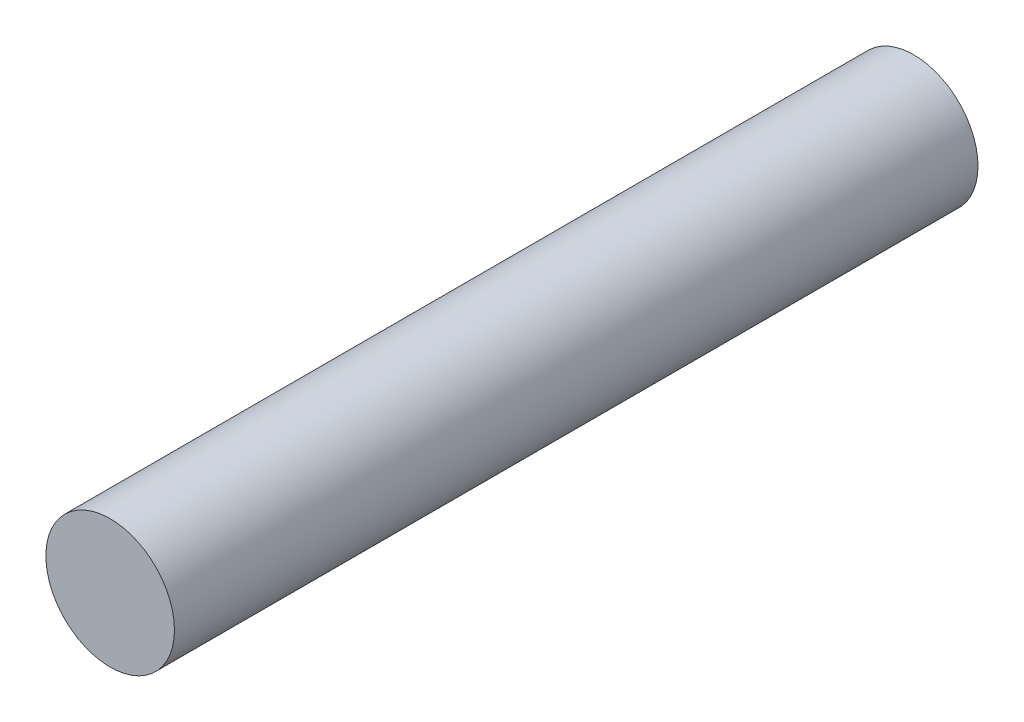
ISO-10303-21;
HEADER;
FILE_DESCRIPTION(('STEP AP214'),'2;1');
FILE_NAME('part.step','',(''),(''),'','','');
FILE_SCHEMA(('AUTOMOTIVE_DESIGN { 1 0 10303 214 1 1 1 1 }'));
ENDSEC;
DATA;
#1=APPLICATION_CONTEXT('core data for automotive mechanical design processes');
#2=APPLICATION_PROTOCOL_DEFINITION('international standard','automotive_design',2000,#1);
#3=PRODUCT_CONTEXT('',#1,'mechanical');
#4=PRODUCT('Part','Part','',(#3));
#5=PRODUCT_RELATED_PRODUCT_CATEGORY('part','',(#4));
#6=PRODUCT_DEFINITION_FORMATION('','',#4);
#7=PRODUCT_DEFINITION_CONTEXT('part definition',#1,'design');
#8=PRODUCT_DEFINITION('design','',#6,#7);
#9=PRODUCT_DEFINITION_SHAPE('','',#8);
#10=(LENGTH_UNIT() NAMED_UNIT(*) SI_UNIT(.MILLI.,.METRE.));
#11=(NAMED_UNIT(*) PLANE_ANGLE_UNIT() SI_UNIT($,.RADIAN.));
#12=(NAMED_UNIT(*) SI_UNIT($,.STERADIAN.) SOLID_ANGLE_UNIT());
#13=UNCERTAINTY_MEASURE_WITH_UNIT(LENGTH_MEASURE(1.E-05),#10,'distance_accuracy_value','');
#14=(GEOMETRIC_REPRESENTATION_CONTEXT(3) GLOBAL_UNCERTAINTY_ASSIGNED_CONTEXT((#13)) GLOBAL_UNIT_ASSIGNED_CONTEXT((#10,
#11,#12)) REPRESENTATION_CONTEXT('',''));
#15=CARTESIAN_POINT('',(0.,0.,0.));
#16=DIRECTION('',(0.,0.,1.));
#17=DIRECTION('',(1.,0.,0.));
#18=AXIS2_PLACEMENT_3D('',#15,#16,#17);
#19=CARTESIAN_POINT('',(0.,0.,5.));
#20=DIRECTION('',(0.,0.,-1.));
#21=DIRECTION('',(-1.,0.,0.));
#22=AXIS2_PLACEMENT_3D('',#19,#20,#21);
#23=CYLINDRICAL_SURFACE('',#22,0.4);
#24=CARTESIAN_POINT('',(0.,0.,5.));
#25=DIRECTION('',(0.,0.,1.));
#26=DIRECTION('',(1.,0.,0.));
#27=AXIS2_PLACEMENT_3D('',#24,#25,#26);
#28=CIRCLE('',#27,0.4);
#29=CARTESIAN_POINT('',(0.4,0.,5.));
#30=VERTEX_POINT('',#29);
#31=EDGE_CURVE('E12',#30,#30,#28,.T.);
#32=ORIENTED_EDGE('',*,*,#31,.F.);
#33=EDGE_LOOP('',(#32));
#34=FACE_BOUND('',#33,.T.);
#35=CARTESIAN_POINT('',(0.,0.,0.));
#36=DIRECTION('',(0.,0.,1.));
#37=DIRECTION('',(1.,0.,0.));
#38=AXIS2_PLACEMENT_3D('',#35,#36,#37);
#39=CIRCLE('',#38,0.4);
#40=CARTESIAN_POINT('',(0.4,0.,0.));
#41=VERTEX_POINT('',#40);
#42=EDGE_CURVE('E47',#41,#41,#39,.T.);
#43=ORIENTED_EDGE('',*,*,#42,.T.);
#44=EDGE_LOOP('',(#43));
#45=FACE_BOUND('',#44,.T.);
#46=ADVANCED_FACE('F44',(#34,#45),#23,.T.);
#47=CARTESIAN_POINT('',(0.,0.,5.));
#48=DIRECTION('',(0.,0.,1.));
#49=DIRECTION('',(1.,0.,0.));
#50=AXIS2_PLACEMENT_3D('',#47,#48,#49);
#51=PLANE('',#50);
#52=ORIENTED_EDGE('',*,*,#31,.T.);
#53=EDGE_LOOP('',(#52));
#54=FACE_BOUND('',#53,.T.);
#55=ADVANCED_FACE('F59',(#54),#51,.T.);
#56=CARTESIAN_POINT('',(0.,0.,0.));
#57=DIRECTION('',(0.,0.,1.));
#58=DIRECTION('',(1.,0.,0.));
#59=AXIS2_PLACEMENT_3D('',#56,#57,#58);
#60=PLANE('',#59);
#61=ORIENTED_EDGE('',*,*,#42,.F.);
#62=EDGE_LOOP('',(#61));
#63=FACE_BOUND('',#62,.T.);
#64=ADVANCED_FACE('F57',(#63),#60,.F.);
#65=CLOSED_SHELL('',(#46,#55,#64));
#66=MANIFOLD_SOLID_BREP('B2',#65);
#67=ADVANCED_BREP_SHAPE_REPRESENTATION('',(#18,#66),#14);
#68=SHAPE_DEFINITION_REPRESENTATION(#9,#67);
ENDSEC;
END-ISO-10303-21;
